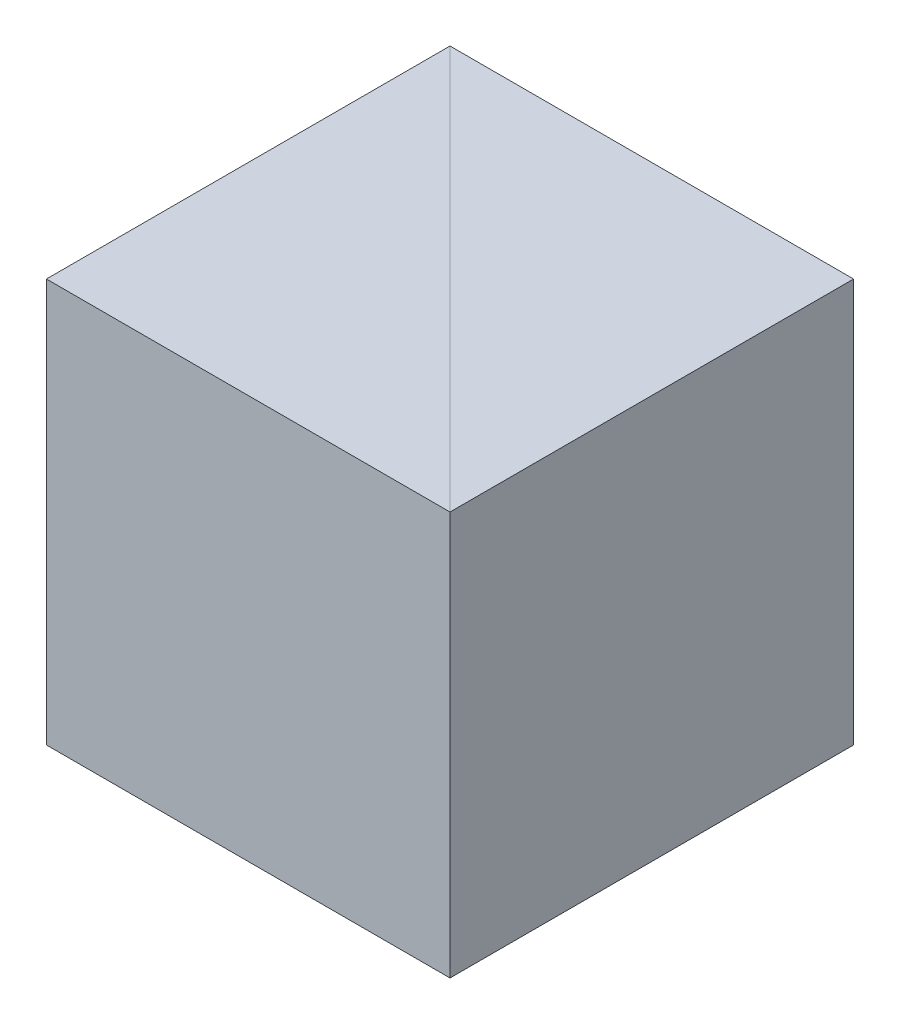
ISO-10303-21;
HEADER;
FILE_DESCRIPTION(('STEP AP214'),'2;1');
FILE_NAME('part.step','',(''),(''),'','','');
FILE_SCHEMA(('AUTOMOTIVE_DESIGN { 1 0 10303 214 1 1 1 1 }'));
ENDSEC;
DATA;
#1=APPLICATION_CONTEXT('core data for automotive mechanical design processes');
#2=APPLICATION_PROTOCOL_DEFINITION('international standard','automotive_design',2000,#1);
#3=PRODUCT_CONTEXT('',#1,'mechanical');
#4=PRODUCT('Part','Part','',(#3));
#5=PRODUCT_RELATED_PRODUCT_CATEGORY('part','',(#4));
#6=PRODUCT_DEFINITION_FORMATION('','',#4);
#7=PRODUCT_DEFINITION_CONTEXT('part definition',#1,'design');
#8=PRODUCT_DEFINITION('design','',#6,#7);
#9=PRODUCT_DEFINITION_SHAPE('','',#8);
#10=(LENGTH_UNIT() NAMED_UNIT(*) SI_UNIT(.MILLI.,.METRE.));
#11=(NAMED_UNIT(*) PLANE_ANGLE_UNIT() SI_UNIT($,.RADIAN.));
#12=(NAMED_UNIT(*) SI_UNIT($,.STERADIAN.) SOLID_ANGLE_UNIT());
#13=UNCERTAINTY_MEASURE_WITH_UNIT(LENGTH_MEASURE(1.E-05),#10,'distance_accuracy_value','');
#14=(GEOMETRIC_REPRESENTATION_CONTEXT(3) GLOBAL_UNCERTAINTY_ASSIGNED_CONTEXT((#13)) GLOBAL_UNIT_ASSIGNED_CONTEXT((#10,
#11,#12)) REPRESENTATION_CONTEXT('',''));
#15=CARTESIAN_POINT('',(0.,0.,0.));
#16=DIRECTION('',(0.,0.,1.));
#17=DIRECTION('',(1.,0.,0.));
#18=AXIS2_PLACEMENT_3D('',#15,#16,#17);
#19=CARTESIAN_POINT('',(0.,0.,0.));
#20=DIRECTION('',(-0.707106781186548,0.,0.707106781186547));
#21=DIRECTION('',(0.707106781186547,0.,0.707106781186548));
#22=AXIS2_PLACEMENT_3D('',#19,#20,#21);
#23=PLANE('',#22);
#24=DIRECTION('',(0.,-1.,0.));
#25=VECTOR('',#24,1.);
#26=CARTESIAN_POINT('',(20.,40.,20.));
#27=LINE('',#26,#25);
#28=CARTESIAN_POINT('',(20.,40.,20.));
#29=VERTEX_POINT('',#28);
#30=CARTESIAN_POINT('',(20.,0.,20.));
#31=VERTEX_POINT('',#30);
#32=EDGE_CURVE('E84',#29,#31,#27,.T.);
#33=ORIENTED_EDGE('',*,*,#32,.F.);
#34=DIRECTION('',(-0.707106781186547,0.,-0.707106781186548));
#35=VECTOR('',#34,1.);
#36=CARTESIAN_POINT('',(0.,40.,0.));
#37=LINE('',#36,#35);
#38=CARTESIAN_POINT('',(-20.,40.,-20.));
#39=VERTEX_POINT('',#38);
#40=EDGE_CURVE('E102',#29,#39,#37,.T.);
#41=ORIENTED_EDGE('',*,*,#40,.T.);
#42=DIRECTION('',(0.,-1.,0.));
#43=VECTOR('',#42,1.);
#44=CARTESIAN_POINT('',(-20.,40.,-20.));
#45=LINE('',#44,#43);
#46=CARTESIAN_POINT('',(-20.,0.,-20.));
#47=VERTEX_POINT('',#46);
#48=EDGE_CURVE('E59',#39,#47,#45,.T.);
#49=ORIENTED_EDGE('',*,*,#48,.T.);
#50=DIRECTION('',(-0.707106781186547,0.,-0.707106781186548));
#51=VECTOR('',#50,1.);
#52=CARTESIAN_POINT('',(0.,0.,0.));
#53=LINE('',#52,#51);
#54=EDGE_CURVE('E101',#31,#47,#53,.T.);
#55=ORIENTED_EDGE('',*,*,#54,.F.);
#56=EDGE_LOOP('',(#33,#41,#49,#55));
#57=FACE_BOUND('',#56,.T.);
#58=ADVANCED_FACE('F55',(#57),#23,.T.);
#59=CARTESIAN_POINT('',(-20.,40.,-20.));
#60=DIRECTION('',(0.,0.,1.));
#61=DIRECTION('',(1.,0.,0.));
#62=AXIS2_PLACEMENT_3D('',#59,#60,#61);
#63=PLANE('',#62);
#64=DIRECTION('',(-1.,0.,0.));
#65=VECTOR('',#64,1.);
#66=CARTESIAN_POINT('',(-20.,0.,-20.));
#67=LINE('',#66,#65);
#68=CARTESIAN_POINT('',(20.,0.,-20.));
#69=VERTEX_POINT('',#68);
#70=EDGE_CURVE('E65',#69,#47,#67,.T.);
#71=ORIENTED_EDGE('',*,*,#70,.T.);
#72=ORIENTED_EDGE('',*,*,#48,.F.);
#73=DIRECTION('',(-1.,0.,0.));
#74=VECTOR('',#73,1.);
#75=CARTESIAN_POINT('',(-20.,40.,-20.));
#76=LINE('',#75,#74);
#77=CARTESIAN_POINT('',(20.,40.,-20.));
#78=VERTEX_POINT('',#77);
#79=EDGE_CURVE('E91',#78,#39,#76,.T.);
#80=ORIENTED_EDGE('',*,*,#79,.F.);
#81=DIRECTION('',(0.,-1.,0.));
#82=VECTOR('',#81,1.);
#83=CARTESIAN_POINT('',(20.,40.,-20.));
#84=LINE('',#83,#82);
#85=EDGE_CURVE('E98',#78,#69,#84,.T.);
#86=ORIENTED_EDGE('',*,*,#85,.T.);
#87=EDGE_LOOP('',(#71,#72,#80,#86));
#88=FACE_BOUND('',#87,.T.);
#89=ADVANCED_FACE('F95',(#88),#63,.F.);
#90=CARTESIAN_POINT('',(20.,40.,20.));
#91=DIRECTION('',(-1.,0.,0.));
#92=DIRECTION('',(0.,0.,1.));
#93=AXIS2_PLACEMENT_3D('',#90,#91,#92);
#94=PLANE('',#93);
#95=DIRECTION('',(0.,0.,-1.));
#96=VECTOR('',#95,1.);
#97=CARTESIAN_POINT('',(20.,0.,20.));
#98=LINE('',#97,#96);
#99=EDGE_CURVE('E12',#31,#69,#98,.T.);
#100=ORIENTED_EDGE('',*,*,#99,.T.);
#101=ORIENTED_EDGE('',*,*,#85,.F.);
#102=DIRECTION('',(0.,0.,-1.));
#103=VECTOR('',#102,1.);
#104=CARTESIAN_POINT('',(20.,40.,20.));
#105=LINE('',#104,#103);
#106=EDGE_CURVE('E99',#29,#78,#105,.T.);
#107=ORIENTED_EDGE('',*,*,#106,.F.);
#108=ORIENTED_EDGE('',*,*,#32,.T.);
#109=EDGE_LOOP('',(#100,#101,#107,#108));
#110=FACE_BOUND('',#109,.T.);
#111=ADVANCED_FACE('F111',(#110),#94,.F.);
#112=CARTESIAN_POINT('',(0.,0.,0.));
#113=DIRECTION('',(0.,-1.,0.));
#114=DIRECTION('',(0.,0.,-1.));
#115=AXIS2_PLACEMENT_3D('',#112,#113,#114);
#116=PLANE('',#115);
#117=ORIENTED_EDGE('',*,*,#99,.F.);
#118=ORIENTED_EDGE('',*,*,#54,.T.);
#119=ORIENTED_EDGE('',*,*,#70,.F.);
#120=EDGE_LOOP('',(#117,#118,#119));
#121=FACE_BOUND('',#120,.T.);
#122=ADVANCED_FACE('F57',(#121),#116,.T.);
#123=CARTESIAN_POINT('',(0.,40.,0.));
#124=DIRECTION('',(0.,-1.,0.));
#125=DIRECTION('',(0.,0.,-1.));
#126=AXIS2_PLACEMENT_3D('',#123,#124,#125);
#127=PLANE('',#126);
#128=ORIENTED_EDGE('',*,*,#40,.F.);
#129=ORIENTED_EDGE('',*,*,#106,.T.);
#130=ORIENTED_EDGE('',*,*,#79,.T.);
#131=EDGE_LOOP('',(#128,#129,#130));
#132=FACE_BOUND('',#131,.T.);
#133=ADVANCED_FACE('F109',(#132),#127,.F.);
#134=CLOSED_SHELL('',(#58,#89,#111,#122,#133));
#135=MANIFOLD_SOLID_BREP('B2',#134);
#136=CARTESIAN_POINT('',(0.,0.,0.));
#137=DIRECTION('',(-0.707106781186548,0.,0.707106781186547));
#138=DIRECTION('',(0.707106781186547,0.,0.707106781186548));
#139=AXIS2_PLACEMENT_3D('',#136,#137,#138);
#140=PLANE('',#139);
#141=DIRECTION('',(0.,-1.,0.));
#142=VECTOR('',#141,1.);
#143=CARTESIAN_POINT('',(20.,40.,20.));
#144=LINE('',#143,#142);
#145=CARTESIAN_POINT('',(20.,40.,20.));
#146=VERTEX_POINT('',#145);
#147=CARTESIAN_POINT('',(20.,0.,20.));
#148=VERTEX_POINT('',#147);
#149=EDGE_CURVE('E53',#146,#148,#144,.T.);
#150=ORIENTED_EDGE('',*,*,#149,.T.);
#151=DIRECTION('',(-0.707106781186547,0.,-0.707106781186548));
#152=VECTOR('',#151,1.);
#153=CARTESIAN_POINT('',(0.,0.,0.));
#154=LINE('',#153,#152);
#155=CARTESIAN_POINT('',(-20.,0.,-20.));
#156=VERTEX_POINT('',#155);
#157=EDGE_CURVE('E160',#148,#156,#154,.T.);
#158=ORIENTED_EDGE('',*,*,#157,.T.);
#159=DIRECTION('',(0.,-1.,0.));
#160=VECTOR('',#159,1.);
#161=CARTESIAN_POINT('',(-20.,40.,-20.));
#162=LINE('',#161,#160);
#163=CARTESIAN_POINT('',(-20.,40.,-20.));
#164=VERTEX_POINT('',#163);
#165=EDGE_CURVE('E193',#164,#156,#162,.T.);
#166=ORIENTED_EDGE('',*,*,#165,.F.);
#167=DIRECTION('',(-0.707106781186547,0.,-0.707106781186548));
#168=VECTOR('',#167,1.);
#169=CARTESIAN_POINT('',(0.,40.,0.));
#170=LINE('',#169,#168);
#171=EDGE_CURVE('E154',#146,#164,#170,.T.);
#172=ORIENTED_EDGE('',*,*,#171,.F.);
#173=EDGE_LOOP('',(#150,#158,#166,#172));
#174=FACE_BOUND('',#173,.T.);
#175=ADVANCED_FACE('F151',(#174),#140,.F.);
#176=CARTESIAN_POINT('',(-20.,40.,20.));
#177=DIRECTION('',(1.,0.,0.));
#178=DIRECTION('',(0.,0.,-1.));
#179=AXIS2_PLACEMENT_3D('',#176,#177,#178);
#180=PLANE('',#179);
#181=DIRECTION('',(0.,0.,1.));
#182=VECTOR('',#181,1.);
#183=CARTESIAN_POINT('',(-20.,0.,20.));
#184=LINE('',#183,#182);
#185=CARTESIAN_POINT('',(-20.,0.,20.));
#186=VERTEX_POINT('',#185);
#187=EDGE_CURVE('E207',#156,#186,#184,.T.);
#188=ORIENTED_EDGE('',*,*,#187,.T.);
#189=DIRECTION('',(0.,-1.,0.));
#190=VECTOR('',#189,1.);
#191=CARTESIAN_POINT('',(-20.,40.,20.));
#192=LINE('',#191,#190);
#193=CARTESIAN_POINT('',(-20.,40.,20.));
#194=VERTEX_POINT('',#193);
#195=EDGE_CURVE('E196',#194,#186,#192,.T.);
#196=ORIENTED_EDGE('',*,*,#195,.F.);
#197=DIRECTION('',(0.,0.,1.));
#198=VECTOR('',#197,1.);
#199=CARTESIAN_POINT('',(-20.,40.,20.));
#200=LINE('',#199,#198);
#201=EDGE_CURVE('E188',#164,#194,#200,.T.);
#202=ORIENTED_EDGE('',*,*,#201,.F.);
#203=ORIENTED_EDGE('',*,*,#165,.T.);
#204=EDGE_LOOP('',(#188,#196,#202,#203));
#205=FACE_BOUND('',#204,.T.);
#206=ADVANCED_FACE('F198',(#205),#180,.F.);
#207=CARTESIAN_POINT('',(-20.,40.,20.));
#208=DIRECTION('',(0.,0.,-1.));
#209=DIRECTION('',(-1.,0.,0.));
#210=AXIS2_PLACEMENT_3D('',#207,#208,#209);
#211=PLANE('',#210);
#212=DIRECTION('',(1.,0.,0.));
#213=VECTOR('',#212,1.);
#214=CARTESIAN_POINT('',(-20.,0.,20.));
#215=LINE('',#214,#213);
#216=EDGE_CURVE('E201',#186,#148,#215,.T.);
#217=ORIENTED_EDGE('',*,*,#216,.T.);
#218=ORIENTED_EDGE('',*,*,#149,.F.);
#219=DIRECTION('',(1.,0.,0.));
#220=VECTOR('',#219,1.);
#221=CARTESIAN_POINT('',(-20.,40.,20.));
#222=LINE('',#221,#220);
#223=EDGE_CURVE('E191',#194,#146,#222,.T.);
#224=ORIENTED_EDGE('',*,*,#223,.F.);
#225=ORIENTED_EDGE('',*,*,#195,.T.);
#226=EDGE_LOOP('',(#217,#218,#224,#225));
#227=FACE_BOUND('',#226,.T.);
#228=ADVANCED_FACE('F215',(#227),#211,.F.);
#229=CARTESIAN_POINT('',(0.,40.,0.));
#230=DIRECTION('',(0.,-1.,0.));
#231=DIRECTION('',(0.,0.,-1.));
#232=AXIS2_PLACEMENT_3D('',#229,#230,#231);
#233=PLANE('',#232);
#234=ORIENTED_EDGE('',*,*,#223,.T.);
#235=ORIENTED_EDGE('',*,*,#171,.T.);
#236=ORIENTED_EDGE('',*,*,#201,.T.);
#237=EDGE_LOOP('',(#234,#235,#236));
#238=FACE_BOUND('',#237,.T.);
#239=ADVANCED_FACE('F186',(#238),#233,.F.);
#240=CARTESIAN_POINT('',(0.,0.,0.));
#241=DIRECTION('',(0.,-1.,0.));
#242=DIRECTION('',(0.,0.,-1.));
#243=AXIS2_PLACEMENT_3D('',#240,#241,#242);
#244=PLANE('',#243);
#245=ORIENTED_EDGE('',*,*,#157,.F.);
#246=ORIENTED_EDGE('',*,*,#216,.F.);
#247=ORIENTED_EDGE('',*,*,#187,.F.);
#248=EDGE_LOOP('',(#245,#246,#247));
#249=FACE_BOUND('',#248,.T.);
#250=ADVANCED_FACE('F216',(#249),#244,.T.);
#251=CLOSED_SHELL('',(#175,#206,#228,#239,#250));
#252=MANIFOLD_SOLID_BREP('B6',#251);
#253=ADVANCED_BREP_SHAPE_REPRESENTATION('',(#18,#135,#252),#14);
#254=SHAPE_DEFINITION_REPRESENTATION(#9,#253);
ENDSEC;
END-ISO-10303-21;
